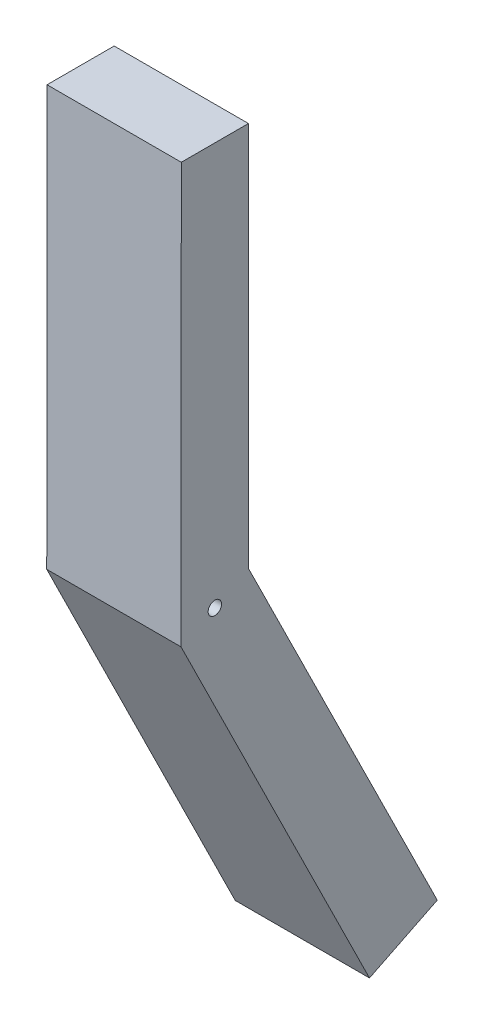
ISO-10303-21;
HEADER;
FILE_DESCRIPTION(('STEP AP214'),'2;1');
FILE_NAME('part.step','',(''),(''),'','','');
FILE_SCHEMA(('AUTOMOTIVE_DESIGN { 1 0 10303 214 1 1 1 1 }'));
ENDSEC;
DATA;
#1=APPLICATION_CONTEXT('core data for automotive mechanical design processes');
#2=APPLICATION_PROTOCOL_DEFINITION('international standard','automotive_design',2000,#1);
#3=PRODUCT_CONTEXT('',#1,'mechanical');
#4=PRODUCT('Part','Part','',(#3));
#5=PRODUCT_RELATED_PRODUCT_CATEGORY('part','',(#4));
#6=PRODUCT_DEFINITION_FORMATION('','',#4);
#7=PRODUCT_DEFINITION_CONTEXT('part definition',#1,'design');
#8=PRODUCT_DEFINITION('design','',#6,#7);
#9=PRODUCT_DEFINITION_SHAPE('','',#8);
#10=(LENGTH_UNIT() NAMED_UNIT(*) SI_UNIT(.MILLI.,.METRE.));
#11=(NAMED_UNIT(*) PLANE_ANGLE_UNIT() SI_UNIT($,.RADIAN.));
#12=(NAMED_UNIT(*) SI_UNIT($,.STERADIAN.) SOLID_ANGLE_UNIT());
#13=UNCERTAINTY_MEASURE_WITH_UNIT(LENGTH_MEASURE(1.E-05),#10,'distance_accuracy_value','');
#14=(GEOMETRIC_REPRESENTATION_CONTEXT(3) GLOBAL_UNCERTAINTY_ASSIGNED_CONTEXT((#13)) GLOBAL_UNIT_ASSIGNED_CONTEXT((#10,
#11,#12)) REPRESENTATION_CONTEXT('',''));
#15=CARTESIAN_POINT('',(0.,0.,0.));
#16=DIRECTION('',(0.,0.,1.));
#17=DIRECTION('',(1.,0.,0.));
#18=AXIS2_PLACEMENT_3D('',#15,#16,#17);
#19=CARTESIAN_POINT('',(-10.,60.,-5.));
#20=DIRECTION('',(0.,0.000831673160752723,-0.999999654159817));
#21=DIRECTION('',(0.,0.999999654159817,0.000831673160752723));
#22=AXIS2_PLACEMENT_3D('',#19,#20,#21);
#23=PLANE('',#22);
#24=DIRECTION('',(1.,0.,0.));
#25=VECTOR('',#24,1.);
#26=CARTESIAN_POINT('',(-10.,60.,-5.));
#27=LINE('',#26,#25);
#28=CARTESIAN_POINT('',(-10.,60.,-5.));
#29=VERTEX_POINT('',#28);
#30=CARTESIAN_POINT('',(10.,60.,-5.));
#31=VERTEX_POINT('',#30);
#32=EDGE_CURVE('E36',#29,#31,#27,.T.);
#33=ORIENTED_EDGE('',*,*,#32,.T.);
#34=DIRECTION('',(0.,0.999999654159817,0.000831673160752723));
#35=VECTOR('',#34,1.);
#36=CARTESIAN_POINT('',(10.,60.,-5.));
#37=LINE('',#36,#35);
#38=CARTESIAN_POINT('',(10.,2.49715489497577,-5.04782358948009));
#39=VERTEX_POINT('',#38);
#40=EDGE_CURVE('E85',#39,#31,#37,.T.);
#41=ORIENTED_EDGE('',*,*,#40,.F.);
#42=DIRECTION('',(1.,0.,0.));
#43=VECTOR('',#42,1.);
#44=CARTESIAN_POINT('',(-10.,2.49715489497577,-5.04782358948009));
#45=LINE('',#44,#43);
#46=CARTESIAN_POINT('',(-10.,2.49715489497577,-5.04782358948009));
#47=VERTEX_POINT('',#46);
#48=EDGE_CURVE('E11',#47,#39,#45,.T.);
#49=ORIENTED_EDGE('',*,*,#48,.F.);
#50=DIRECTION('',(0.,0.999999654159817,0.000831673160752723));
#51=VECTOR('',#50,1.);
#52=CARTESIAN_POINT('',(-10.,60.,-5.));
#53=LINE('',#52,#51);
#54=EDGE_CURVE('E86',#47,#29,#53,.T.);
#55=ORIENTED_EDGE('',*,*,#54,.T.);
#56=EDGE_LOOP('',(#33,#41,#49,#55));
#57=FACE_BOUND('',#56,.T.);
#58=ADVANCED_FACE('F33',(#57),#23,.T.);
#59=CARTESIAN_POINT('',(-10.,2.49715489497577,-5.04782358948009));
#60=DIRECTION('',(0.,0.443408674671012,-0.896319556423097));
#61=DIRECTION('',(0.,0.896319556423097,0.443408674671012));
#62=AXIS2_PLACEMENT_3D('',#59,#60,#61);
#63=PLANE('',#62);
#64=ORIENTED_EDGE('',*,*,#48,.T.);
#65=DIRECTION('',(0.,0.896319556423096,0.443408674671012));
#66=VECTOR('',#65,1.);
#67=CARTESIAN_POINT('',(10.,2.49715489497577,-5.04782358948009));
#68=LINE('',#67,#66);
#69=CARTESIAN_POINT('',(10.,-54.2764956926966,-33.1337099041505));
#70=VERTEX_POINT('',#69);
#71=EDGE_CURVE('E104',#70,#39,#68,.T.);
#72=ORIENTED_EDGE('',*,*,#71,.F.);
#73=DIRECTION('',(1.,0.,0.));
#74=VECTOR('',#73,1.);
#75=CARTESIAN_POINT('',(-10.,-54.2764956926966,-33.1337099041505));
#76=LINE('',#75,#74);
#77=CARTESIAN_POINT('',(-10.,-54.2764956926966,-33.1337099041505));
#78=VERTEX_POINT('',#77);
#79=EDGE_CURVE('E41',#78,#70,#76,.T.);
#80=ORIENTED_EDGE('',*,*,#79,.F.);
#81=DIRECTION('',(0.,0.896319556423096,0.443408674671012));
#82=VECTOR('',#81,1.);
#83=CARTESIAN_POINT('',(-10.,2.49715489497577,-5.04782358948009));
#84=LINE('',#83,#82);
#85=EDGE_CURVE('E91',#78,#47,#84,.T.);
#86=ORIENTED_EDGE('',*,*,#85,.T.);
#87=EDGE_LOOP('',(#64,#72,#80,#86));
#88=FACE_BOUND('',#87,.T.);
#89=ADVANCED_FACE('F150',(#88),#63,.T.);
#90=CARTESIAN_POINT('',(-10.,-59.2708054826481,-23.0380627251904));
#91=DIRECTION('',(0.,-0.896319556423096,-0.443408674671013));
#92=DIRECTION('',(0.,0.443408674671013,-0.896319556423096));
#93=AXIS2_PLACEMENT_3D('',#90,#91,#92);
#94=PLANE('',#93);
#95=ORIENTED_EDGE('',*,*,#79,.T.);
#96=DIRECTION('',(0.,0.443408674671013,-0.896319556423096));
#97=VECTOR('',#96,1.);
#98=CARTESIAN_POINT('',(10.,-59.2708054826481,-23.0380627251904));
#99=LINE('',#98,#97);
#100=CARTESIAN_POINT('',(10.,-59.2708054826481,-23.0380627251904));
#101=VERTEX_POINT('',#100);
#102=EDGE_CURVE('E114',#101,#70,#99,.T.);
#103=ORIENTED_EDGE('',*,*,#102,.F.);
#104=DIRECTION('',(1.,0.,0.));
#105=VECTOR('',#104,1.);
#106=CARTESIAN_POINT('',(-10.,-59.2708054826481,-23.0380627251904));
#107=LINE('',#106,#105);
#108=CARTESIAN_POINT('',(-10.,-59.2708054826481,-23.0380627251904));
#109=VERTEX_POINT('',#108);
#110=EDGE_CURVE('E133',#109,#101,#107,.T.);
#111=ORIENTED_EDGE('',*,*,#110,.F.);
#112=DIRECTION('',(0.,0.443408674671013,-0.896319556423096));
#113=VECTOR('',#112,1.);
#114=CARTESIAN_POINT('',(-10.,-59.2708054826481,-23.0380627251904));
#115=LINE('',#114,#113);
#116=EDGE_CURVE('E129',#109,#78,#115,.T.);
#117=ORIENTED_EDGE('',*,*,#116,.T.);
#118=EDGE_LOOP('',(#95,#103,#111,#117));
#119=FACE_BOUND('',#118,.T.);
#120=ADVANCED_FACE('F146',(#119),#94,.T.);
#121=CARTESIAN_POINT('',(-10.,-59.2708054826481,-23.0380627251904));
#122=DIRECTION('',(0.,-0.443408674671012,0.896319556423096));
#123=DIRECTION('',(0.,-0.896319556423096,-0.443408674671012));
#124=AXIS2_PLACEMENT_3D('',#121,#122,#123);
#125=PLANE('',#124);
#126=ORIENTED_EDGE('',*,*,#110,.T.);
#127=DIRECTION('',(0.,-0.896319556423096,-0.443408674671012));
#128=VECTOR('',#127,1.);
#129=CARTESIAN_POINT('',(10.,-59.2708054826481,-23.0380627251904));
#130=LINE('',#129,#128);
#131=CARTESIAN_POINT('',(10.,-2.49715489497575,5.04782358948009));
#132=VERTEX_POINT('',#131);
#133=EDGE_CURVE('E111',#132,#101,#130,.T.);
#134=ORIENTED_EDGE('',*,*,#133,.F.);
#135=DIRECTION('',(1.,0.,0.));
#136=VECTOR('',#135,1.);
#137=CARTESIAN_POINT('',(-10.,-2.49715489497575,5.04782358948009));
#138=LINE('',#137,#136);
#139=CARTESIAN_POINT('',(-10.,-2.49715489497575,5.04782358948009));
#140=VERTEX_POINT('',#139);
#141=EDGE_CURVE('E135',#140,#132,#138,.T.);
#142=ORIENTED_EDGE('',*,*,#141,.F.);
#143=DIRECTION('',(0.,-0.896319556423096,-0.443408674671012));
#144=VECTOR('',#143,1.);
#145=CARTESIAN_POINT('',(-10.,-59.2708054826481,-23.0380627251904));
#146=LINE('',#145,#144);
#147=EDGE_CURVE('E126',#140,#109,#146,.T.);
#148=ORIENTED_EDGE('',*,*,#147,.T.);
#149=EDGE_LOOP('',(#126,#134,#142,#148));
#150=FACE_BOUND('',#149,.T.);
#151=ADVANCED_FACE('F143',(#150),#125,.T.);
#152=CARTESIAN_POINT('',(-10.,-2.49715489497575,5.04782358948009));
#153=DIRECTION('',(0.,0.00076521204139473,0.999999707225223));
#154=DIRECTION('',(0.,-0.999999707225223,0.00076521204139473));
#155=AXIS2_PLACEMENT_3D('',#152,#153,#154);
#156=PLANE('',#155);
#157=ORIENTED_EDGE('',*,*,#141,.T.);
#158=DIRECTION('',(0.,-0.999999707225223,0.00076521204139473));
#159=VECTOR('',#158,1.);
#160=CARTESIAN_POINT('',(10.,-2.49715489497575,5.04782358948009));
#161=LINE('',#160,#159);
#162=CARTESIAN_POINT('',(10.,60.,5.));
#163=VERTEX_POINT('',#162);
#164=EDGE_CURVE('E98',#163,#132,#161,.T.);
#165=ORIENTED_EDGE('',*,*,#164,.F.);
#166=DIRECTION('',(1.,0.,0.));
#167=VECTOR('',#166,1.);
#168=CARTESIAN_POINT('',(-10.,60.,5.));
#169=LINE('',#168,#167);
#170=CARTESIAN_POINT('',(-10.,60.,5.));
#171=VERTEX_POINT('',#170);
#172=EDGE_CURVE('E90',#171,#163,#169,.T.);
#173=ORIENTED_EDGE('',*,*,#172,.F.);
#174=DIRECTION('',(0.,-0.999999707225223,0.00076521204139473));
#175=VECTOR('',#174,1.);
#176=CARTESIAN_POINT('',(-10.,-2.49715489497575,5.04782358948009));
#177=LINE('',#176,#175);
#178=EDGE_CURVE('E123',#171,#140,#177,.T.);
#179=ORIENTED_EDGE('',*,*,#178,.T.);
#180=EDGE_LOOP('',(#157,#165,#173,#179));
#181=FACE_BOUND('',#180,.T.);
#182=ADVANCED_FACE('F137',(#181),#156,.T.);
#183=CARTESIAN_POINT('',(-10.,60.,5.));
#184=DIRECTION('',(0.,1.,0.));
#185=DIRECTION('',(0.,0.,1.));
#186=AXIS2_PLACEMENT_3D('',#183,#184,#185);
#187=PLANE('',#186);
#188=ORIENTED_EDGE('',*,*,#172,.T.);
#189=DIRECTION('',(0.,0.,1.));
#190=VECTOR('',#189,1.);
#191=CARTESIAN_POINT('',(10.,60.,5.));
#192=LINE('',#191,#190);
#193=EDGE_CURVE('E93',#31,#163,#192,.T.);
#194=ORIENTED_EDGE('',*,*,#193,.F.);
#195=ORIENTED_EDGE('',*,*,#32,.F.);
#196=DIRECTION('',(0.,0.,1.));
#197=VECTOR('',#196,1.);
#198=CARTESIAN_POINT('',(-10.,60.,5.));
#199=LINE('',#198,#197);
#200=EDGE_CURVE('E121',#29,#171,#199,.T.);
#201=ORIENTED_EDGE('',*,*,#200,.T.);
#202=EDGE_LOOP('',(#188,#194,#195,#201));
#203=FACE_BOUND('',#202,.T.);
#204=ADVANCED_FACE('F94',(#203),#187,.T.);
#205=CARTESIAN_POINT('',(-10.,0.,0.));
#206=DIRECTION('',(1.,0.,0.));
#207=DIRECTION('',(0.,0.,-1.));
#208=AXIS2_PLACEMENT_3D('',#205,#206,#207);
#209=PLANE('',#208);
#210=CARTESIAN_POINT('',(-10.,0.,0.));
#211=DIRECTION('',(1.,0.,0.));
#212=DIRECTION('',(0.,0.,-1.));
#213=AXIS2_PLACEMENT_3D('',#210,#211,#212);
#214=CIRCLE('',#213,1.);
#215=CARTESIAN_POINT('',(-10.,0.,-0.999999999999999));
#216=VERTEX_POINT('',#215);
#217=EDGE_CURVE('E117',#216,#216,#214,.T.);
#218=ORIENTED_EDGE('',*,*,#217,.T.);
#219=EDGE_LOOP('',(#218));
#220=FACE_BOUND('',#219,.T.);
#221=ORIENTED_EDGE('',*,*,#54,.F.);
#222=ORIENTED_EDGE('',*,*,#85,.F.);
#223=ORIENTED_EDGE('',*,*,#116,.F.);
#224=ORIENTED_EDGE('',*,*,#147,.F.);
#225=ORIENTED_EDGE('',*,*,#178,.F.);
#226=ORIENTED_EDGE('',*,*,#200,.F.);
#227=EDGE_LOOP('',(#221,#222,#223,#224,#225,#226));
#228=FACE_BOUND('',#227,.T.);
#229=ADVANCED_FACE('F149',(#220,#228),#209,.F.);
#230=CARTESIAN_POINT('',(-10.,0.,0.));
#231=DIRECTION('',(1.,0.,0.));
#232=DIRECTION('',(0.,0.,-1.));
#233=AXIS2_PLACEMENT_3D('',#230,#231,#232);
#234=CYLINDRICAL_SURFACE('',#233,1.);
#235=ORIENTED_EDGE('',*,*,#217,.F.);
#236=EDGE_LOOP('',(#235));
#237=FACE_BOUND('',#236,.T.);
#238=CARTESIAN_POINT('',(10.,0.,0.));
#239=DIRECTION('',(1.,0.,0.));
#240=DIRECTION('',(0.,0.,-1.));
#241=AXIS2_PLACEMENT_3D('',#238,#239,#240);
#242=CIRCLE('',#241,1.);
#243=CARTESIAN_POINT('',(10.,0.,-0.999999999999999));
#244=VERTEX_POINT('',#243);
#245=EDGE_CURVE('E105',#244,#244,#242,.T.);
#246=ORIENTED_EDGE('',*,*,#245,.T.);
#247=EDGE_LOOP('',(#246));
#248=FACE_BOUND('',#247,.T.);
#249=ADVANCED_FACE('F168',(#237,#248),#234,.F.);
#250=CARTESIAN_POINT('',(10.,0.,0.));
#251=DIRECTION('',(1.,0.,0.));
#252=DIRECTION('',(0.,0.,-1.));
#253=AXIS2_PLACEMENT_3D('',#250,#251,#252);
#254=PLANE('',#253);
#255=ORIENTED_EDGE('',*,*,#40,.T.);
#256=ORIENTED_EDGE('',*,*,#193,.T.);
#257=ORIENTED_EDGE('',*,*,#164,.T.);
#258=ORIENTED_EDGE('',*,*,#133,.T.);
#259=ORIENTED_EDGE('',*,*,#102,.T.);
#260=ORIENTED_EDGE('',*,*,#71,.T.);
#261=EDGE_LOOP('',(#255,#256,#257,#258,#259,#260));
#262=FACE_BOUND('',#261,.T.);
#263=ORIENTED_EDGE('',*,*,#245,.F.);
#264=EDGE_LOOP('',(#263));
#265=FACE_BOUND('',#264,.T.);
#266=ADVANCED_FACE('F101',(#262,#265),#254,.T.);
#267=CLOSED_SHELL('',(#58,#89,#120,#151,#182,#204,#229,#249,#266));
#268=MANIFOLD_SOLID_BREP('B2',#267);
#269=ADVANCED_BREP_SHAPE_REPRESENTATION('',(#18,#268),#14);
#270=SHAPE_DEFINITION_REPRESENTATION(#9,#269);
ENDSEC;
END-ISO-10303-21;
